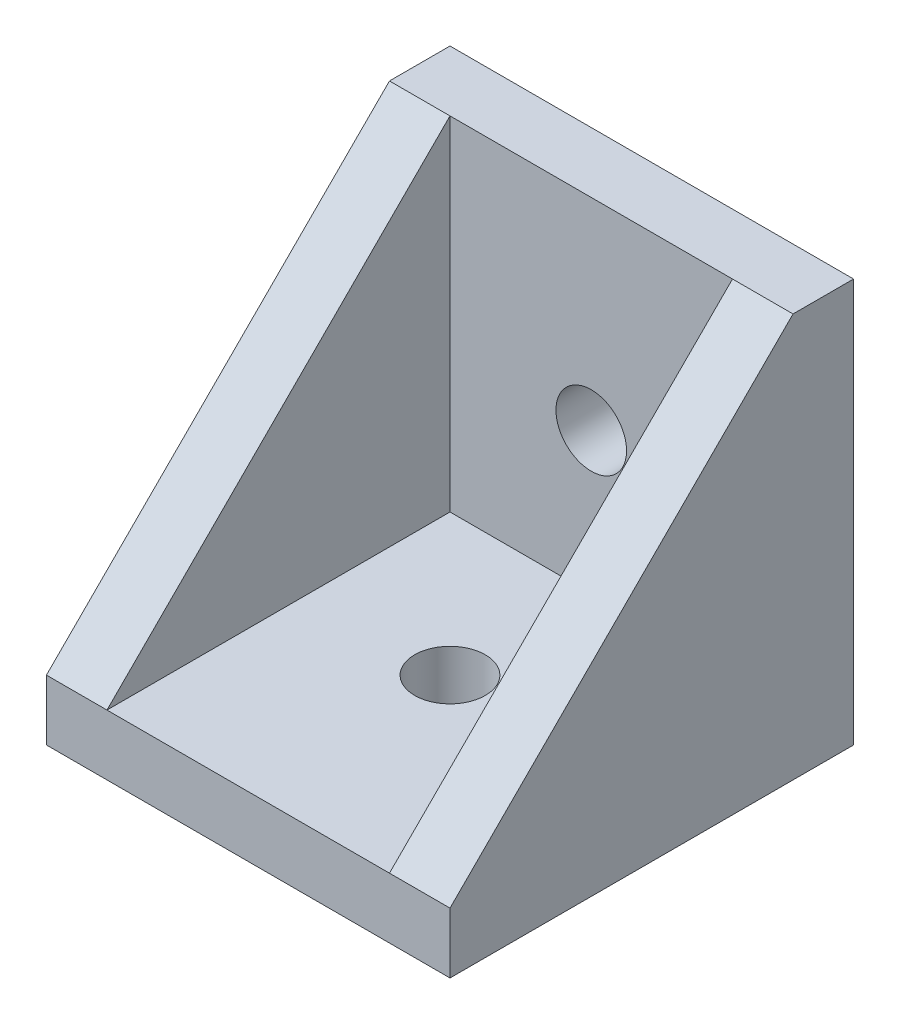
ISO-10303-21;
HEADER;
FILE_DESCRIPTION(('STEP AP214'),'2;1');
FILE_NAME('part.step','',(''),(''),'','','');
FILE_SCHEMA(('AUTOMOTIVE_DESIGN { 1 0 10303 214 1 1 1 1 }'));
ENDSEC;
DATA;
#1=APPLICATION_CONTEXT('core data for automotive mechanical design processes');
#2=APPLICATION_PROTOCOL_DEFINITION('international standard','automotive_design',2000,#1);
#3=PRODUCT_CONTEXT('',#1,'mechanical');
#4=PRODUCT('Part','Part','',(#3));
#5=PRODUCT_RELATED_PRODUCT_CATEGORY('part','',(#4));
#6=PRODUCT_DEFINITION_FORMATION('','',#4);
#7=PRODUCT_DEFINITION_CONTEXT('part definition',#1,'design');
#8=PRODUCT_DEFINITION('design','',#6,#7);
#9=PRODUCT_DEFINITION_SHAPE('','',#8);
#10=(LENGTH_UNIT() NAMED_UNIT(*) SI_UNIT(.MILLI.,.METRE.));
#11=(NAMED_UNIT(*) PLANE_ANGLE_UNIT() SI_UNIT($,.RADIAN.));
#12=(NAMED_UNIT(*) SI_UNIT($,.STERADIAN.) SOLID_ANGLE_UNIT());
#13=UNCERTAINTY_MEASURE_WITH_UNIT(LENGTH_MEASURE(1.E-05),#10,'distance_accuracy_value','');
#14=(GEOMETRIC_REPRESENTATION_CONTEXT(3) GLOBAL_UNCERTAINTY_ASSIGNED_CONTEXT((#13)) GLOBAL_UNIT_ASSIGNED_CONTEXT((#10,
#11,#12)) REPRESENTATION_CONTEXT('',''));
#15=CARTESIAN_POINT('',(0.,0.,0.));
#16=DIRECTION('',(0.,0.,1.));
#17=DIRECTION('',(1.,0.,0.));
#18=AXIS2_PLACEMENT_3D('',#15,#16,#17);
#19=CARTESIAN_POINT('',(0.,3.,0.));
#20=DIRECTION('',(0.,-1.,0.));
#21=DIRECTION('',(0.,0.,-1.));
#22=AXIS2_PLACEMENT_3D('',#19,#20,#21);
#23=PLANE('',#22);
#24=CARTESIAN_POINT('',(0.,3.,0.));
#25=DIRECTION('',(0.,1.,0.));
#26=DIRECTION('',(0.,0.,1.));
#27=AXIS2_PLACEMENT_3D('',#24,#25,#26);
#28=CIRCLE('',#27,1.75);
#29=CARTESIAN_POINT('',(0.,3.,1.75000000000001));
#30=VERTEX_POINT('',#29);
#31=EDGE_CURVE('E141',#30,#30,#28,.T.);
#32=ORIENTED_EDGE('',*,*,#31,.F.);
#33=EDGE_LOOP('',(#32));
#34=FACE_BOUND('',#33,.T.);
#35=DIRECTION('',(1.,0.,0.));
#36=VECTOR('',#35,1.);
#37=CARTESIAN_POINT('',(-10.,3.,10.));
#38=LINE('',#37,#36);
#39=CARTESIAN_POINT('',(-7.,3.,10.));
#40=VERTEX_POINT('',#39);
#41=CARTESIAN_POINT('',(7.,3.,10.));
#42=VERTEX_POINT('',#41);
#43=EDGE_CURVE('E124',#40,#42,#38,.T.);
#44=ORIENTED_EDGE('',*,*,#43,.T.);
#45=DIRECTION('',(0.,0.,-1.));
#46=VECTOR('',#45,1.);
#47=CARTESIAN_POINT('',(7.,3.,-6.99999999999999));
#48=LINE('',#47,#46);
#49=CARTESIAN_POINT('',(7.,3.,-6.99999999999999));
#50=VERTEX_POINT('',#49);
#51=EDGE_CURVE('E101',#42,#50,#48,.T.);
#52=ORIENTED_EDGE('',*,*,#51,.T.);
#53=DIRECTION('',(1.,0.,0.));
#54=VECTOR('',#53,1.);
#55=CARTESIAN_POINT('',(-10.,3.,-6.99999999999999));
#56=LINE('',#55,#54);
#57=CARTESIAN_POINT('',(-7.,3.,-7.));
#58=VERTEX_POINT('',#57);
#59=EDGE_CURVE('E183',#58,#50,#56,.T.);
#60=ORIENTED_EDGE('',*,*,#59,.F.);
#61=DIRECTION('',(0.,0.,1.));
#62=VECTOR('',#61,1.);
#63=CARTESIAN_POINT('',(-7.,3.,10.));
#64=LINE('',#63,#62);
#65=EDGE_CURVE('E128',#58,#40,#64,.T.);
#66=ORIENTED_EDGE('',*,*,#65,.T.);
#67=EDGE_LOOP('',(#44,#52,#60,#66));
#68=FACE_BOUND('',#67,.T.);
#69=ADVANCED_FACE('F34',(#34,#68),#23,.F.);
#70=CARTESIAN_POINT('',(-10.,20.,-6.99999999999999));
#71=DIRECTION('',(0.,0.,-1.));
#72=DIRECTION('',(-1.,0.,0.));
#73=AXIS2_PLACEMENT_3D('',#70,#71,#72);
#74=PLANE('',#73);
#75=CARTESIAN_POINT('',(0.,10.,-6.99999999999999));
#76=DIRECTION('',(0.,0.,1.));
#77=DIRECTION('',(1.,0.,0.));
#78=AXIS2_PLACEMENT_3D('',#75,#76,#77);
#79=CIRCLE('',#78,1.75);
#80=CARTESIAN_POINT('',(1.75,10.,-6.99999999999999));
#81=VERTEX_POINT('',#80);
#82=EDGE_CURVE('E176',#81,#81,#79,.T.);
#83=ORIENTED_EDGE('',*,*,#82,.F.);
#84=EDGE_LOOP('',(#83));
#85=FACE_BOUND('',#84,.T.);
#86=ORIENTED_EDGE('',*,*,#59,.T.);
#87=DIRECTION('',(0.,1.,0.));
#88=VECTOR('',#87,1.);
#89=CARTESIAN_POINT('',(7.,20.,-6.99999999999999));
#90=LINE('',#89,#88);
#91=CARTESIAN_POINT('',(7.,20.,-6.99999999999999));
#92=VERTEX_POINT('',#91);
#93=EDGE_CURVE('E106',#50,#92,#90,.T.);
#94=ORIENTED_EDGE('',*,*,#93,.T.);
#95=DIRECTION('',(1.,0.,0.));
#96=VECTOR('',#95,1.);
#97=CARTESIAN_POINT('',(-10.,20.,-6.99999999999999));
#98=LINE('',#97,#96);
#99=CARTESIAN_POINT('',(-7.,20.,-6.99999999999999));
#100=VERTEX_POINT('',#99);
#101=EDGE_CURVE('E185',#100,#92,#98,.T.);
#102=ORIENTED_EDGE('',*,*,#101,.F.);
#103=DIRECTION('',(0.,-1.,0.));
#104=VECTOR('',#103,1.);
#105=CARTESIAN_POINT('',(-7.,3.,-7.));
#106=LINE('',#105,#104);
#107=EDGE_CURVE('E171',#100,#58,#106,.T.);
#108=ORIENTED_EDGE('',*,*,#107,.T.);
#109=EDGE_LOOP('',(#86,#94,#102,#108));
#110=FACE_BOUND('',#109,.T.);
#111=ADVANCED_FACE('F213',(#85,#110),#74,.F.);
#112=CARTESIAN_POINT('',(0.,0.,0.));
#113=DIRECTION('',(0.,-1.,0.));
#114=DIRECTION('',(0.,0.,-1.));
#115=AXIS2_PLACEMENT_3D('',#112,#113,#114);
#116=PLANE('',#115);
#117=DIRECTION('',(0.,0.,-1.));
#118=VECTOR('',#117,1.);
#119=CARTESIAN_POINT('',(10.,0.,10.));
#120=LINE('',#119,#118);
#121=CARTESIAN_POINT('',(10.,0.,10.));
#122=VERTEX_POINT('',#121);
#123=CARTESIAN_POINT('',(10.,0.,-9.99999999999999));
#124=VERTEX_POINT('',#123);
#125=EDGE_CURVE('E137',#122,#124,#120,.T.);
#126=ORIENTED_EDGE('',*,*,#125,.F.);
#127=DIRECTION('',(1.,0.,0.));
#128=VECTOR('',#127,1.);
#129=CARTESIAN_POINT('',(-10.,0.,10.));
#130=LINE('',#129,#128);
#131=CARTESIAN_POINT('',(-10.,0.,10.));
#132=VERTEX_POINT('',#131);
#133=EDGE_CURVE('E57',#132,#122,#130,.T.);
#134=ORIENTED_EDGE('',*,*,#133,.F.);
#135=DIRECTION('',(0.,0.,1.));
#136=VECTOR('',#135,1.);
#137=CARTESIAN_POINT('',(-10.,0.,10.));
#138=LINE('',#137,#136);
#139=CARTESIAN_POINT('',(-10.,0.,-9.99999999999999));
#140=VERTEX_POINT('',#139);
#141=EDGE_CURVE('E131',#140,#132,#138,.T.);
#142=ORIENTED_EDGE('',*,*,#141,.F.);
#143=DIRECTION('',(-1.,0.,0.));
#144=VECTOR('',#143,1.);
#145=CARTESIAN_POINT('',(-10.,0.,-9.99999999999999));
#146=LINE('',#145,#144);
#147=EDGE_CURVE('E140',#124,#140,#146,.T.);
#148=ORIENTED_EDGE('',*,*,#147,.F.);
#149=EDGE_LOOP('',(#126,#134,#142,#148));
#150=FACE_BOUND('',#149,.T.);
#151=CARTESIAN_POINT('',(0.,0.,0.));
#152=DIRECTION('',(0.,1.,0.));
#153=DIRECTION('',(0.,0.,1.));
#154=AXIS2_PLACEMENT_3D('',#151,#152,#153);
#155=CIRCLE('',#154,1.75);
#156=CARTESIAN_POINT('',(0.,0.,1.75000000000001));
#157=VERTEX_POINT('',#156);
#158=EDGE_CURVE('E135',#157,#157,#155,.T.);
#159=ORIENTED_EDGE('',*,*,#158,.T.);
#160=EDGE_LOOP('',(#159));
#161=FACE_BOUND('',#160,.T.);
#162=ADVANCED_FACE('F160',(#150,#161),#116,.T.);
#163=CARTESIAN_POINT('',(10.,3.,10.));
#164=DIRECTION('',(-1.,0.,0.));
#165=DIRECTION('',(0.,0.,1.));
#166=AXIS2_PLACEMENT_3D('',#163,#164,#165);
#167=PLANE('',#166);
#168=ORIENTED_EDGE('',*,*,#125,.T.);
#169=DIRECTION('',(0.,-1.,0.));
#170=VECTOR('',#169,1.);
#171=CARTESIAN_POINT('',(10.,3.,-9.99999999999999));
#172=LINE('',#171,#170);
#173=CARTESIAN_POINT('',(10.,20.,-9.99999999999999));
#174=VERTEX_POINT('',#173);
#175=EDGE_CURVE('E11',#174,#124,#172,.T.);
#176=ORIENTED_EDGE('',*,*,#175,.F.);
#177=DIRECTION('',(0.,0.,-1.));
#178=VECTOR('',#177,1.);
#179=CARTESIAN_POINT('',(10.,20.,-9.99999999999999));
#180=LINE('',#179,#178);
#181=CARTESIAN_POINT('',(10.,20.,-6.99999999999999));
#182=VERTEX_POINT('',#181);
#183=EDGE_CURVE('E165',#182,#174,#180,.T.);
#184=ORIENTED_EDGE('',*,*,#183,.F.);
#185=DIRECTION('',(0.,-0.707106781186547,0.707106781186547));
#186=VECTOR('',#185,1.);
#187=CARTESIAN_POINT('',(10.,3.,10.));
#188=LINE('',#187,#186);
#189=CARTESIAN_POINT('',(10.,3.,10.));
#190=VERTEX_POINT('',#189);
#191=EDGE_CURVE('E119',#182,#190,#188,.T.);
#192=ORIENTED_EDGE('',*,*,#191,.T.);
#193=DIRECTION('',(0.,-1.,0.));
#194=VECTOR('',#193,1.);
#195=CARTESIAN_POINT('',(10.,3.,10.));
#196=LINE('',#195,#194);
#197=EDGE_CURVE('E125',#190,#122,#196,.T.);
#198=ORIENTED_EDGE('',*,*,#197,.T.);
#199=EDGE_LOOP('',(#168,#176,#184,#192,#198));
#200=FACE_BOUND('',#199,.T.);
#201=ADVANCED_FACE('F36',(#200),#167,.F.);
#202=CARTESIAN_POINT('',(-10.,3.,-9.99999999999999));
#203=DIRECTION('',(0.,0.,1.));
#204=DIRECTION('',(1.,0.,0.));
#205=AXIS2_PLACEMENT_3D('',#202,#203,#204);
#206=PLANE('',#205);
#207=CARTESIAN_POINT('',(0.,10.,-9.99999999999999));
#208=DIRECTION('',(0.,0.,1.));
#209=DIRECTION('',(1.,0.,0.));
#210=AXIS2_PLACEMENT_3D('',#207,#208,#209);
#211=CIRCLE('',#210,1.75);
#212=CARTESIAN_POINT('',(1.75,10.,-9.99999999999999));
#213=VERTEX_POINT('',#212);
#214=EDGE_CURVE('E180',#213,#213,#211,.T.);
#215=ORIENTED_EDGE('',*,*,#214,.T.);
#216=EDGE_LOOP('',(#215));
#217=FACE_BOUND('',#216,.T.);
#218=ORIENTED_EDGE('',*,*,#147,.T.);
#219=DIRECTION('',(0.,-1.,0.));
#220=VECTOR('',#219,1.);
#221=CARTESIAN_POINT('',(-10.,3.,-9.99999999999999));
#222=LINE('',#221,#220);
#223=CARTESIAN_POINT('',(-10.,20.,-9.99999999999999));
#224=VERTEX_POINT('',#223);
#225=EDGE_CURVE('E42',#224,#140,#222,.T.);
#226=ORIENTED_EDGE('',*,*,#225,.F.);
#227=DIRECTION('',(-1.,0.,0.));
#228=VECTOR('',#227,1.);
#229=CARTESIAN_POINT('',(-10.,20.,-9.99999999999999));
#230=LINE('',#229,#228);
#231=EDGE_CURVE('E190',#174,#224,#230,.T.);
#232=ORIENTED_EDGE('',*,*,#231,.F.);
#233=ORIENTED_EDGE('',*,*,#175,.T.);
#234=EDGE_LOOP('',(#218,#226,#232,#233));
#235=FACE_BOUND('',#234,.T.);
#236=ADVANCED_FACE('F223',(#217,#235),#206,.F.);
#237=CARTESIAN_POINT('',(-10.,3.,10.));
#238=DIRECTION('',(1.,0.,0.));
#239=DIRECTION('',(0.,0.,-1.));
#240=AXIS2_PLACEMENT_3D('',#237,#238,#239);
#241=PLANE('',#240);
#242=DIRECTION('',(0.,-1.,0.));
#243=VECTOR('',#242,1.);
#244=CARTESIAN_POINT('',(-10.,3.,10.));
#245=LINE('',#244,#243);
#246=CARTESIAN_POINT('',(-10.,3.,10.));
#247=VERTEX_POINT('',#246);
#248=EDGE_CURVE('E145',#247,#132,#245,.T.);
#249=ORIENTED_EDGE('',*,*,#248,.F.);
#250=DIRECTION('',(0.,0.707106781186547,-0.707106781186547));
#251=VECTOR('',#250,1.);
#252=CARTESIAN_POINT('',(-10.,20.,-6.99999999999999));
#253=LINE('',#252,#251);
#254=CARTESIAN_POINT('',(-10.,20.,-6.99999999999999));
#255=VERTEX_POINT('',#254);
#256=EDGE_CURVE('E169',#247,#255,#253,.T.);
#257=ORIENTED_EDGE('',*,*,#256,.T.);
#258=DIRECTION('',(0.,0.,1.));
#259=VECTOR('',#258,1.);
#260=CARTESIAN_POINT('',(-10.,20.,-9.99999999999999));
#261=LINE('',#260,#259);
#262=EDGE_CURVE('E154',#224,#255,#261,.T.);
#263=ORIENTED_EDGE('',*,*,#262,.F.);
#264=ORIENTED_EDGE('',*,*,#225,.T.);
#265=ORIENTED_EDGE('',*,*,#141,.T.);
#266=EDGE_LOOP('',(#249,#257,#263,#264,#265));
#267=FACE_BOUND('',#266,.T.);
#268=ADVANCED_FACE('F151',(#267),#241,.F.);
#269=CARTESIAN_POINT('',(-10.,3.,10.));
#270=DIRECTION('',(0.,0.,-1.));
#271=DIRECTION('',(-1.,0.,0.));
#272=AXIS2_PLACEMENT_3D('',#269,#270,#271);
#273=PLANE('',#272);
#274=ORIENTED_EDGE('',*,*,#133,.T.);
#275=ORIENTED_EDGE('',*,*,#197,.F.);
#276=DIRECTION('',(1.,0.,0.));
#277=VECTOR('',#276,1.);
#278=CARTESIAN_POINT('',(7.,3.,10.));
#279=LINE('',#278,#277);
#280=EDGE_CURVE('E115',#42,#190,#279,.T.);
#281=ORIENTED_EDGE('',*,*,#280,.F.);
#282=ORIENTED_EDGE('',*,*,#43,.F.);
#283=EDGE_CURVE('E129',#247,#40,#38,.T.);
#284=ORIENTED_EDGE('',*,*,#283,.F.);
#285=ORIENTED_EDGE('',*,*,#248,.T.);
#286=EDGE_LOOP('',(#274,#275,#281,#282,#284,#285));
#287=FACE_BOUND('',#286,.T.);
#288=ADVANCED_FACE('F122',(#287),#273,.F.);
#289=CARTESIAN_POINT('',(0.,3.,0.));
#290=DIRECTION('',(0.,-1.,0.));
#291=DIRECTION('',(0.,0.,-1.));
#292=AXIS2_PLACEMENT_3D('',#289,#290,#291);
#293=CYLINDRICAL_SURFACE('',#292,1.75);
#294=ORIENTED_EDGE('',*,*,#31,.T.);
#295=EDGE_LOOP('',(#294));
#296=FACE_BOUND('',#295,.T.);
#297=ORIENTED_EDGE('',*,*,#158,.F.);
#298=EDGE_LOOP('',(#297));
#299=FACE_BOUND('',#298,.T.);
#300=ADVANCED_FACE('F198',(#296,#299),#293,.F.);
#301=CARTESIAN_POINT('',(0.,20.,0.));
#302=DIRECTION('',(0.,1.,0.));
#303=DIRECTION('',(0.,0.,1.));
#304=AXIS2_PLACEMENT_3D('',#301,#302,#303);
#305=PLANE('',#304);
#306=ORIENTED_EDGE('',*,*,#262,.T.);
#307=EDGE_CURVE('E186',#255,#100,#98,.T.);
#308=ORIENTED_EDGE('',*,*,#307,.T.);
#309=ORIENTED_EDGE('',*,*,#101,.T.);
#310=DIRECTION('',(1.,0.,0.));
#311=VECTOR('',#310,1.);
#312=CARTESIAN_POINT('',(7.,20.,-6.99999999999999));
#313=LINE('',#312,#311);
#314=EDGE_CURVE('E118',#92,#182,#313,.T.);
#315=ORIENTED_EDGE('',*,*,#314,.T.);
#316=ORIENTED_EDGE('',*,*,#183,.T.);
#317=ORIENTED_EDGE('',*,*,#231,.T.);
#318=EDGE_LOOP('',(#306,#308,#309,#315,#316,#317));
#319=FACE_BOUND('',#318,.T.);
#320=ADVANCED_FACE('F200',(#319),#305,.T.);
#321=CARTESIAN_POINT('',(0.,10.,-24.));
#322=DIRECTION('',(0.,0.,1.));
#323=DIRECTION('',(1.,0.,0.));
#324=AXIS2_PLACEMENT_3D('',#321,#322,#323);
#325=CYLINDRICAL_SURFACE('',#324,1.75);
#326=ORIENTED_EDGE('',*,*,#82,.T.);
#327=EDGE_LOOP('',(#326));
#328=FACE_BOUND('',#327,.T.);
#329=ORIENTED_EDGE('',*,*,#214,.F.);
#330=EDGE_LOOP('',(#329));
#331=FACE_BOUND('',#330,.T.);
#332=ADVANCED_FACE('F206',(#328,#331),#325,.F.);
#333=CARTESIAN_POINT('',(-7.,20.,-6.99999999999999));
#334=DIRECTION('',(0.,0.707106781186548,0.707106781186548));
#335=DIRECTION('',(0.,-0.707106781186548,0.707106781186548));
#336=AXIS2_PLACEMENT_3D('',#333,#334,#335);
#337=PLANE('',#336);
#338=ORIENTED_EDGE('',*,*,#256,.F.);
#339=ORIENTED_EDGE('',*,*,#283,.T.);
#340=DIRECTION('',(0.,0.707106781186547,-0.707106781186547));
#341=VECTOR('',#340,1.);
#342=CARTESIAN_POINT('',(-7.,20.,-6.99999999999999));
#343=LINE('',#342,#341);
#344=EDGE_CURVE('E49',#40,#100,#343,.T.);
#345=ORIENTED_EDGE('',*,*,#344,.T.);
#346=ORIENTED_EDGE('',*,*,#307,.F.);
#347=EDGE_LOOP('',(#338,#339,#345,#346));
#348=FACE_BOUND('',#347,.T.);
#349=ADVANCED_FACE('F236',(#348),#337,.T.);
#350=CARTESIAN_POINT('',(-7.,0.,0.));
#351=DIRECTION('',(-1.,0.,0.));
#352=DIRECTION('',(0.,0.,1.));
#353=AXIS2_PLACEMENT_3D('',#350,#351,#352);
#354=PLANE('',#353);
#355=ORIENTED_EDGE('',*,*,#107,.F.);
#356=ORIENTED_EDGE('',*,*,#344,.F.);
#357=ORIENTED_EDGE('',*,*,#65,.F.);
#358=EDGE_LOOP('',(#355,#356,#357));
#359=FACE_BOUND('',#358,.T.);
#360=ADVANCED_FACE('F234',(#359),#354,.F.);
#361=CARTESIAN_POINT('',(7.,3.,10.));
#362=DIRECTION('',(0.,0.707106781186548,0.707106781186548));
#363=DIRECTION('',(0.,-0.707106781186548,0.707106781186548));
#364=AXIS2_PLACEMENT_3D('',#361,#362,#363);
#365=PLANE('',#364);
#366=ORIENTED_EDGE('',*,*,#191,.F.);
#367=ORIENTED_EDGE('',*,*,#314,.F.);
#368=DIRECTION('',(0.,-0.707106781186547,0.707106781186547));
#369=VECTOR('',#368,1.);
#370=CARTESIAN_POINT('',(7.,3.,10.));
#371=LINE('',#370,#369);
#372=EDGE_CURVE('E104',#92,#42,#371,.T.);
#373=ORIENTED_EDGE('',*,*,#372,.T.);
#374=ORIENTED_EDGE('',*,*,#280,.T.);
#375=EDGE_LOOP('',(#366,#367,#373,#374));
#376=FACE_BOUND('',#375,.T.);
#377=ADVANCED_FACE('F114',(#376),#365,.T.);
#378=CARTESIAN_POINT('',(7.,0.,0.));
#379=DIRECTION('',(-1.,0.,0.));
#380=DIRECTION('',(0.,0.,1.));
#381=AXIS2_PLACEMENT_3D('',#378,#379,#380);
#382=PLANE('',#381);
#383=ORIENTED_EDGE('',*,*,#372,.F.);
#384=ORIENTED_EDGE('',*,*,#93,.F.);
#385=ORIENTED_EDGE('',*,*,#51,.F.);
#386=EDGE_LOOP('',(#383,#384,#385));
#387=FACE_BOUND('',#386,.T.);
#388=ADVANCED_FACE('F103',(#387),#382,.T.);
#389=CLOSED_SHELL('',(#69,#111,#162,#201,#236,#268,#288,#300,#320,#332,#349,#360,#377,#388));
#390=MANIFOLD_SOLID_BREP('B2',#389);
#391=ADVANCED_BREP_SHAPE_REPRESENTATION('',(#18,#390),#14);
#392=SHAPE_DEFINITION_REPRESENTATION(#9,#391);
ENDSEC;
END-ISO-10303-21;
